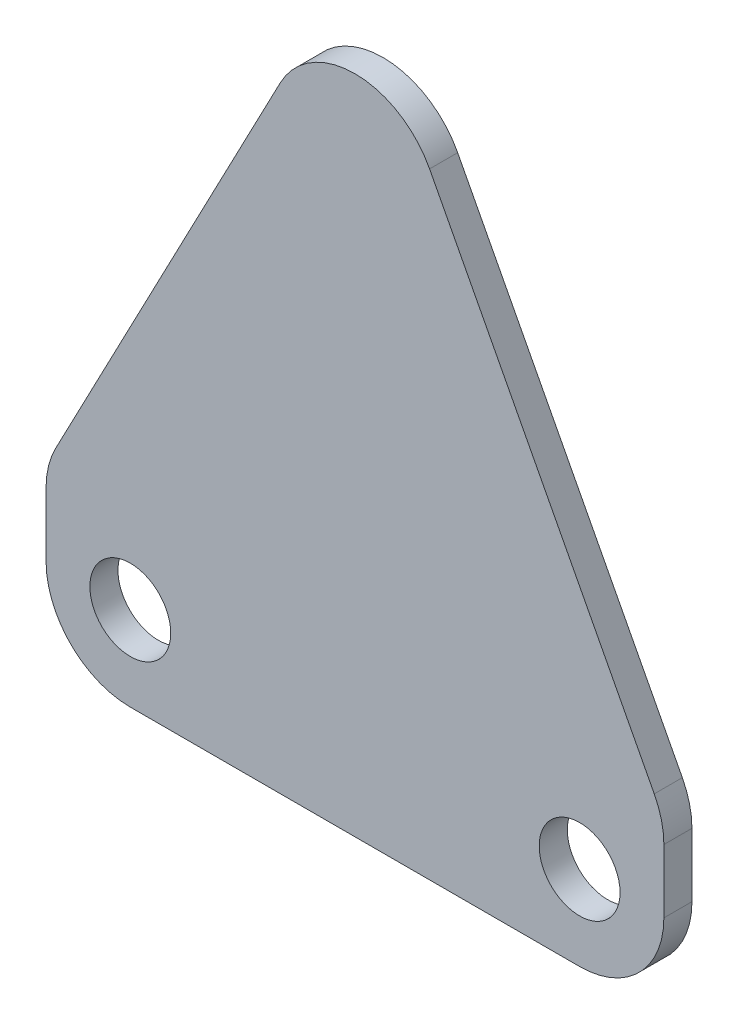
ISO-10303-21;
HEADER;
FILE_DESCRIPTION(('STEP AP214'),'2;1');
FILE_NAME('part.step','',(''),(''),'','','');
FILE_SCHEMA(('AUTOMOTIVE_DESIGN { 1 0 10303 214 1 1 1 1 }'));
ENDSEC;
DATA;
#1=APPLICATION_CONTEXT('core data for automotive mechanical design processes');
#2=APPLICATION_PROTOCOL_DEFINITION('international standard','automotive_design',2000,#1);
#3=PRODUCT_CONTEXT('',#1,'mechanical');
#4=PRODUCT('Part','Part','',(#3));
#5=PRODUCT_RELATED_PRODUCT_CATEGORY('part','',(#4));
#6=PRODUCT_DEFINITION_FORMATION('','',#4);
#7=PRODUCT_DEFINITION_CONTEXT('part definition',#1,'design');
#8=PRODUCT_DEFINITION('design','',#6,#7);
#9=PRODUCT_DEFINITION_SHAPE('','',#8);
#10=(LENGTH_UNIT() NAMED_UNIT(*) SI_UNIT(.MILLI.,.METRE.));
#11=(NAMED_UNIT(*) PLANE_ANGLE_UNIT() SI_UNIT($,.RADIAN.));
#12=(NAMED_UNIT(*) SI_UNIT($,.STERADIAN.) SOLID_ANGLE_UNIT());
#13=UNCERTAINTY_MEASURE_WITH_UNIT(LENGTH_MEASURE(1.E-05),#10,'distance_accuracy_value','');
#14=(GEOMETRIC_REPRESENTATION_CONTEXT(3) GLOBAL_UNCERTAINTY_ASSIGNED_CONTEXT((#13)) GLOBAL_UNIT_ASSIGNED_CONTEXT((#10,
#11,#12)) REPRESENTATION_CONTEXT('',''));
#15=CARTESIAN_POINT('',(0.,0.,0.));
#16=DIRECTION('',(0.,0.,1.));
#17=DIRECTION('',(1.,0.,0.));
#18=AXIS2_PLACEMENT_3D('',#15,#16,#17);
#19=CARTESIAN_POINT('',(0.,0.,1.5875));
#20=DIRECTION('',(0.,0.,-1.));
#21=DIRECTION('',(-1.,0.,0.));
#22=AXIS2_PLACEMENT_3D('',#19,#20,#21);
#23=PLANE('',#22);
#24=DIRECTION('',(0.,-1.,0.));
#25=VECTOR('',#24,1.);
#26=CARTESIAN_POINT('',(-17.4625,9.525,1.5875));
#27=LINE('',#26,#25);
#28=CARTESIAN_POINT('',(-17.4625,8.35319155858997,1.5875));
#29=VERTEX_POINT('',#28);
#30=CARTESIAN_POINT('',(-17.4625,4.7625,1.5875));
#31=VERTEX_POINT('',#30);
#32=EDGE_CURVE('E204',#29,#31,#27,.T.);
#33=ORIENTED_EDGE('',*,*,#32,.T.);
#34=CARTESIAN_POINT('',(-12.7,4.7625,1.5875));
#35=DIRECTION('',(0.,0.,-1.));
#36=DIRECTION('',(-1.,0.,0.));
#37=AXIS2_PLACEMENT_3D('',#34,#35,#36);
#38=CIRCLE('',#37,4.7625);
#39=CARTESIAN_POINT('',(-12.7,0.,1.5875));
#40=VERTEX_POINT('',#39);
#41=EDGE_CURVE('E175',#31,#40,#38,.F.);
#42=ORIENTED_EDGE('',*,*,#41,.T.);
#43=DIRECTION('',(1.,0.,0.));
#44=VECTOR('',#43,1.);
#45=CARTESIAN_POINT('',(-17.4625,0.,1.5875));
#46=LINE('',#45,#44);
#47=CARTESIAN_POINT('',(12.7,0.,1.5875));
#48=VERTEX_POINT('',#47);
#49=EDGE_CURVE('E141',#40,#48,#46,.T.);
#50=ORIENTED_EDGE('',*,*,#49,.T.);
#51=CARTESIAN_POINT('',(12.7,4.7625,1.5875));
#52=DIRECTION('',(0.,0.,-1.));
#53=DIRECTION('',(-1.,0.,0.));
#54=AXIS2_PLACEMENT_3D('',#51,#52,#53);
#55=CIRCLE('',#54,4.7625);
#56=CARTESIAN_POINT('',(17.4625,4.7625,1.5875));
#57=VERTEX_POINT('',#56);
#58=EDGE_CURVE('E171',#48,#57,#55,.F.);
#59=ORIENTED_EDGE('',*,*,#58,.T.);
#60=DIRECTION('',(0.,1.,0.));
#61=VECTOR('',#60,1.);
#62=CARTESIAN_POINT('',(17.4625,0.,1.5875));
#63=LINE('',#62,#61);
#64=CARTESIAN_POINT('',(17.4625,8.35319155858996,1.5875));
#65=VERTEX_POINT('',#64);
#66=EDGE_CURVE('E149',#57,#65,#63,.T.);
#67=ORIENTED_EDGE('',*,*,#66,.T.);
#68=CARTESIAN_POINT('',(12.7,8.35319155858997,1.5875));
#69=DIRECTION('',(0.,0.,-1.));
#70=DIRECTION('',(-1.,0.,0.));
#71=AXIS2_PLACEMENT_3D('',#68,#69,#70);
#72=CIRCLE('',#71,4.7625);
#73=CARTESIAN_POINT('',(16.9187726867717,10.5630248707085,1.5875));
#74=VERTEX_POINT('',#73);
#75=EDGE_CURVE('E168',#65,#74,#72,.F.);
#76=ORIENTED_EDGE('',*,*,#75,.T.);
#77=DIRECTION('',(-0.464006994670557,0.885831535280155,0.));
#78=VECTOR('',#77,1.);
#79=CARTESIAN_POINT('',(17.4625,9.525,1.5875));
#80=LINE('',#79,#78);
#81=CARTESIAN_POINT('',(4.21877268677174,34.808479416163,1.5875));
#82=VERTEX_POINT('',#81);
#83=EDGE_CURVE('E153',#74,#82,#80,.T.);
#84=ORIENTED_EDGE('',*,*,#83,.T.);
#85=CARTESIAN_POINT('',(0.,32.5986461040445,1.5875));
#86=DIRECTION('',(0.,0.,-1.));
#87=DIRECTION('',(-1.,0.,0.));
#88=AXIS2_PLACEMENT_3D('',#85,#86,#87);
#89=CIRCLE('',#88,4.7625);
#90=CARTESIAN_POINT('',(-4.21877268677174,34.808479416163,1.5875));
#91=VERTEX_POINT('',#90);
#92=EDGE_CURVE('E65',#82,#91,#89,.F.);
#93=ORIENTED_EDGE('',*,*,#92,.T.);
#94=DIRECTION('',(-0.464006994670557,-0.885831535280155,0.));
#95=VECTOR('',#94,1.);
#96=CARTESIAN_POINT('',(0.,42.8625,1.5875));
#97=LINE('',#96,#95);
#98=CARTESIAN_POINT('',(-16.9187726867717,10.5630248707085,1.5875));
#99=VERTEX_POINT('',#98);
#100=EDGE_CURVE('E207',#91,#99,#97,.T.);
#101=ORIENTED_EDGE('',*,*,#100,.T.);
#102=CARTESIAN_POINT('',(-12.7,8.35319155858997,1.5875));
#103=DIRECTION('',(0.,0.,-1.));
#104=DIRECTION('',(-1.,0.,0.));
#105=AXIS2_PLACEMENT_3D('',#102,#103,#104);
#106=CIRCLE('',#105,4.7625);
#107=EDGE_CURVE('E173',#99,#29,#106,.F.);
#108=ORIENTED_EDGE('',*,*,#107,.T.);
#109=EDGE_LOOP('',(#33,#42,#50,#59,#67,#76,#84,#93,#101,#108));
#110=FACE_BOUND('',#109,.T.);
#111=CARTESIAN_POINT('',(-12.7,4.7625,1.5875));
#112=DIRECTION('',(0.,0.,1.));
#113=DIRECTION('',(1.,0.,0.));
#114=AXIS2_PLACEMENT_3D('',#111,#112,#113);
#115=CIRCLE('',#114,2.286);
#116=CARTESIAN_POINT('',(-10.414,4.7625,1.5875));
#117=VERTEX_POINT('',#116);
#118=EDGE_CURVE('E200',#117,#117,#115,.T.);
#119=ORIENTED_EDGE('',*,*,#118,.F.);
#120=EDGE_LOOP('',(#119));
#121=FACE_BOUND('',#120,.T.);
#122=CARTESIAN_POINT('',(12.7,4.7625,1.5875));
#123=DIRECTION('',(0.,0.,1.));
#124=DIRECTION('',(1.,0.,0.));
#125=AXIS2_PLACEMENT_3D('',#122,#123,#124);
#126=CIRCLE('',#125,2.286);
#127=CARTESIAN_POINT('',(14.986,4.7625,1.5875));
#128=VERTEX_POINT('',#127);
#129=EDGE_CURVE('E213',#128,#128,#126,.T.);
#130=ORIENTED_EDGE('',*,*,#129,.F.);
#131=EDGE_LOOP('',(#130));
#132=FACE_BOUND('',#131,.T.);
#133=ADVANCED_FACE('F43',(#110,#121,#132),#23,.F.);
#134=CARTESIAN_POINT('',(0.,0.,0.));
#135=DIRECTION('',(0.,0.,-1.));
#136=DIRECTION('',(-1.,0.,0.));
#137=AXIS2_PLACEMENT_3D('',#134,#135,#136);
#138=PLANE('',#137);
#139=CARTESIAN_POINT('',(-12.7,4.7625,0.));
#140=DIRECTION('',(0.,0.,1.));
#141=DIRECTION('',(1.,0.,0.));
#142=AXIS2_PLACEMENT_3D('',#139,#140,#141);
#143=CIRCLE('',#142,2.286);
#144=CARTESIAN_POINT('',(-10.414,4.7625,0.));
#145=VERTEX_POINT('',#144);
#146=EDGE_CURVE('E210',#145,#145,#143,.T.);
#147=ORIENTED_EDGE('',*,*,#146,.T.);
#148=EDGE_LOOP('',(#147));
#149=FACE_BOUND('',#148,.T.);
#150=DIRECTION('',(1.,0.,0.));
#151=VECTOR('',#150,1.);
#152=CARTESIAN_POINT('',(-17.4625,0.,0.));
#153=LINE('',#152,#151);
#154=CARTESIAN_POINT('',(-12.7,0.,0.));
#155=VERTEX_POINT('',#154);
#156=CARTESIAN_POINT('',(12.7,0.,0.));
#157=VERTEX_POINT('',#156);
#158=EDGE_CURVE('E138',#155,#157,#153,.T.);
#159=ORIENTED_EDGE('',*,*,#158,.F.);
#160=CARTESIAN_POINT('',(-12.7,4.7625,0.));
#161=DIRECTION('',(0.,0.,-1.));
#162=DIRECTION('',(-1.,0.,0.));
#163=AXIS2_PLACEMENT_3D('',#160,#161,#162);
#164=CIRCLE('',#163,4.7625);
#165=CARTESIAN_POINT('',(-17.4625,4.7625,0.));
#166=VERTEX_POINT('',#165);
#167=EDGE_CURVE('E121',#155,#166,#164,.T.);
#168=ORIENTED_EDGE('',*,*,#167,.T.);
#169=DIRECTION('',(0.,-1.,0.));
#170=VECTOR('',#169,1.);
#171=CARTESIAN_POINT('',(-17.4625,9.525,0.));
#172=LINE('',#171,#170);
#173=CARTESIAN_POINT('',(-17.4625,8.35319155858997,0.));
#174=VERTEX_POINT('',#173);
#175=EDGE_CURVE('E150',#174,#166,#172,.T.);
#176=ORIENTED_EDGE('',*,*,#175,.F.);
#177=CARTESIAN_POINT('',(-12.7,8.35319155858997,0.));
#178=DIRECTION('',(0.,0.,-1.));
#179=DIRECTION('',(-1.,0.,0.));
#180=AXIS2_PLACEMENT_3D('',#177,#178,#179);
#181=CIRCLE('',#180,4.7625);
#182=CARTESIAN_POINT('',(-16.9187726867717,10.5630248707085,0.));
#183=VERTEX_POINT('',#182);
#184=EDGE_CURVE('E132',#174,#183,#181,.T.);
#185=ORIENTED_EDGE('',*,*,#184,.T.);
#186=DIRECTION('',(-0.464006994670557,-0.885831535280155,0.));
#187=VECTOR('',#186,1.);
#188=CARTESIAN_POINT('',(0.,42.8625,0.));
#189=LINE('',#188,#187);
#190=CARTESIAN_POINT('',(-4.21877268677174,34.808479416163,0.));
#191=VERTEX_POINT('',#190);
#192=EDGE_CURVE('E155',#191,#183,#189,.T.);
#193=ORIENTED_EDGE('',*,*,#192,.F.);
#194=CARTESIAN_POINT('',(0.,32.5986461040445,0.));
#195=DIRECTION('',(0.,0.,-1.));
#196=DIRECTION('',(-1.,0.,0.));
#197=AXIS2_PLACEMENT_3D('',#194,#195,#196);
#198=CIRCLE('',#197,4.7625);
#199=CARTESIAN_POINT('',(4.21877268677174,34.808479416163,0.));
#200=VERTEX_POINT('',#199);
#201=EDGE_CURVE('E161',#191,#200,#198,.T.);
#202=ORIENTED_EDGE('',*,*,#201,.T.);
#203=DIRECTION('',(-0.464006994670557,0.885831535280155,0.));
#204=VECTOR('',#203,1.);
#205=CARTESIAN_POINT('',(17.4625,9.525,0.));
#206=LINE('',#205,#204);
#207=CARTESIAN_POINT('',(16.9187726867717,10.5630248707085,0.));
#208=VERTEX_POINT('',#207);
#209=EDGE_CURVE('E192',#208,#200,#206,.T.);
#210=ORIENTED_EDGE('',*,*,#209,.F.);
#211=CARTESIAN_POINT('',(12.7,8.35319155858997,0.));
#212=DIRECTION('',(0.,0.,-1.));
#213=DIRECTION('',(-1.,0.,0.));
#214=AXIS2_PLACEMENT_3D('',#211,#212,#213);
#215=CIRCLE('',#214,4.7625);
#216=CARTESIAN_POINT('',(17.4625,8.35319155858996,0.));
#217=VERTEX_POINT('',#216);
#218=EDGE_CURVE('E142',#208,#217,#215,.T.);
#219=ORIENTED_EDGE('',*,*,#218,.T.);
#220=DIRECTION('',(0.,1.,0.));
#221=VECTOR('',#220,1.);
#222=CARTESIAN_POINT('',(17.4625,0.,0.));
#223=LINE('',#222,#221);
#224=CARTESIAN_POINT('',(17.4625,4.7625,0.));
#225=VERTEX_POINT('',#224);
#226=EDGE_CURVE('E198',#225,#217,#223,.T.);
#227=ORIENTED_EDGE('',*,*,#226,.F.);
#228=CARTESIAN_POINT('',(12.7,4.7625,0.));
#229=DIRECTION('',(0.,0.,-1.));
#230=DIRECTION('',(-1.,0.,0.));
#231=AXIS2_PLACEMENT_3D('',#228,#229,#230);
#232=CIRCLE('',#231,4.7625);
#233=EDGE_CURVE('E148',#225,#157,#232,.T.);
#234=ORIENTED_EDGE('',*,*,#233,.T.);
#235=EDGE_LOOP('',(#159,#168,#176,#185,#193,#202,#210,#219,#227,#234));
#236=FACE_BOUND('',#235,.T.);
#237=CARTESIAN_POINT('',(12.7,4.7625,0.));
#238=DIRECTION('',(0.,0.,1.));
#239=DIRECTION('',(1.,0.,0.));
#240=AXIS2_PLACEMENT_3D('',#237,#238,#239);
#241=CIRCLE('',#240,2.286);
#242=CARTESIAN_POINT('',(14.986,4.7625,0.));
#243=VERTEX_POINT('',#242);
#244=EDGE_CURVE('E216',#243,#243,#241,.T.);
#245=ORIENTED_EDGE('',*,*,#244,.T.);
#246=EDGE_LOOP('',(#245));
#247=FACE_BOUND('',#246,.T.);
#248=ADVANCED_FACE('F145',(#149,#236,#247),#138,.T.);
#249=CARTESIAN_POINT('',(17.4625,0.,1.5875));
#250=DIRECTION('',(-1.,0.,0.));
#251=DIRECTION('',(0.,0.,1.));
#252=AXIS2_PLACEMENT_3D('',#249,#250,#251);
#253=PLANE('',#252);
#254=ORIENTED_EDGE('',*,*,#66,.F.);
#255=DIRECTION('',(0.,0.,-1.));
#256=VECTOR('',#255,1.);
#257=CARTESIAN_POINT('',(17.4625,4.7625,1.5875));
#258=LINE('',#257,#256);
#259=EDGE_CURVE('E183',#57,#225,#258,.T.);
#260=ORIENTED_EDGE('',*,*,#259,.T.);
#261=ORIENTED_EDGE('',*,*,#226,.T.);
#262=DIRECTION('',(0.,0.,-1.));
#263=VECTOR('',#262,1.);
#264=CARTESIAN_POINT('',(17.4625,8.35319155858997,1.5875));
#265=LINE('',#264,#263);
#266=EDGE_CURVE('E181',#217,#65,#265,.F.);
#267=ORIENTED_EDGE('',*,*,#266,.T.);
#268=EDGE_LOOP('',(#254,#260,#261,#267));
#269=FACE_BOUND('',#268,.T.);
#270=ADVANCED_FACE('F230',(#269),#253,.F.);
#271=CARTESIAN_POINT('',(17.4625,9.525,1.5875));
#272=DIRECTION('',(-0.885831535280155,-0.464006994670557,0.));
#273=DIRECTION('',(0.464006994670558,-0.885831535280156,0.));
#274=AXIS2_PLACEMENT_3D('',#271,#272,#273);
#275=PLANE('',#274);
#276=ORIENTED_EDGE('',*,*,#209,.T.);
#277=DIRECTION('',(0.,0.,-1.));
#278=VECTOR('',#277,1.);
#279=CARTESIAN_POINT('',(4.21877268677174,34.808479416163,1.5875));
#280=LINE('',#279,#278);
#281=EDGE_CURVE('E11',#200,#82,#280,.F.);
#282=ORIENTED_EDGE('',*,*,#281,.T.);
#283=ORIENTED_EDGE('',*,*,#83,.F.);
#284=DIRECTION('',(0.,0.,-1.));
#285=VECTOR('',#284,1.);
#286=CARTESIAN_POINT('',(16.9187726867717,10.5630248707085,1.5875));
#287=LINE('',#286,#285);
#288=EDGE_CURVE('E51',#74,#208,#287,.T.);
#289=ORIENTED_EDGE('',*,*,#288,.T.);
#290=EDGE_LOOP('',(#276,#282,#283,#289));
#291=FACE_BOUND('',#290,.T.);
#292=ADVANCED_FACE('F191',(#291),#275,.F.);
#293=CARTESIAN_POINT('',(0.,42.8625,1.5875));
#294=DIRECTION('',(0.885831535280155,-0.464006994670557,0.));
#295=DIRECTION('',(0.464006994670558,0.885831535280156,0.));
#296=AXIS2_PLACEMENT_3D('',#293,#294,#295);
#297=PLANE('',#296);
#298=ORIENTED_EDGE('',*,*,#192,.T.);
#299=DIRECTION('',(0.,0.,-1.));
#300=VECTOR('',#299,1.);
#301=CARTESIAN_POINT('',(-16.9187726867717,10.5630248707085,1.5875));
#302=LINE('',#301,#300);
#303=EDGE_CURVE('E58',#183,#99,#302,.F.);
#304=ORIENTED_EDGE('',*,*,#303,.T.);
#305=ORIENTED_EDGE('',*,*,#100,.F.);
#306=DIRECTION('',(0.,0.,-1.));
#307=VECTOR('',#306,1.);
#308=CARTESIAN_POINT('',(-4.21877268677174,34.808479416163,1.5875));
#309=LINE('',#308,#307);
#310=EDGE_CURVE('E177',#91,#191,#309,.T.);
#311=ORIENTED_EDGE('',*,*,#310,.T.);
#312=EDGE_LOOP('',(#298,#304,#305,#311));
#313=FACE_BOUND('',#312,.T.);
#314=ADVANCED_FACE('F243',(#313),#297,.F.);
#315=CARTESIAN_POINT('',(-17.4625,9.525,1.5875));
#316=DIRECTION('',(1.,0.,0.));
#317=DIRECTION('',(0.,0.,-1.));
#318=AXIS2_PLACEMENT_3D('',#315,#316,#317);
#319=PLANE('',#318);
#320=ORIENTED_EDGE('',*,*,#175,.T.);
#321=DIRECTION('',(0.,0.,-1.));
#322=VECTOR('',#321,1.);
#323=CARTESIAN_POINT('',(-17.4625,4.7625,1.5875));
#324=LINE('',#323,#322);
#325=EDGE_CURVE('E126',#166,#31,#324,.F.);
#326=ORIENTED_EDGE('',*,*,#325,.T.);
#327=ORIENTED_EDGE('',*,*,#32,.F.);
#328=DIRECTION('',(0.,0.,-1.));
#329=VECTOR('',#328,1.);
#330=CARTESIAN_POINT('',(-17.4625,8.35319155858997,1.5875));
#331=LINE('',#330,#329);
#332=EDGE_CURVE('E131',#29,#174,#331,.T.);
#333=ORIENTED_EDGE('',*,*,#332,.T.);
#334=EDGE_LOOP('',(#320,#326,#327,#333));
#335=FACE_BOUND('',#334,.T.);
#336=ADVANCED_FACE('F240',(#335),#319,.F.);
#337=CARTESIAN_POINT('',(-17.4625,0.,1.5875));
#338=DIRECTION('',(0.,1.,0.));
#339=DIRECTION('',(0.,0.,1.));
#340=AXIS2_PLACEMENT_3D('',#337,#338,#339);
#341=PLANE('',#340);
#342=ORIENTED_EDGE('',*,*,#49,.F.);
#343=DIRECTION('',(0.,0.,-1.));
#344=VECTOR('',#343,1.);
#345=CARTESIAN_POINT('',(-12.7,0.,1.5875));
#346=LINE('',#345,#344);
#347=EDGE_CURVE('E125',#40,#155,#346,.T.);
#348=ORIENTED_EDGE('',*,*,#347,.T.);
#349=ORIENTED_EDGE('',*,*,#158,.T.);
#350=DIRECTION('',(0.,0.,-1.));
#351=VECTOR('',#350,1.);
#352=CARTESIAN_POINT('',(12.7,0.,1.5875));
#353=LINE('',#352,#351);
#354=EDGE_CURVE('E143',#157,#48,#353,.F.);
#355=ORIENTED_EDGE('',*,*,#354,.T.);
#356=EDGE_LOOP('',(#342,#348,#349,#355));
#357=FACE_BOUND('',#356,.T.);
#358=ADVANCED_FACE('F137',(#357),#341,.F.);
#359=CARTESIAN_POINT('',(-12.7,4.7625,1.5875));
#360=DIRECTION('',(0.,0.,-1.));
#361=DIRECTION('',(-1.,0.,0.));
#362=AXIS2_PLACEMENT_3D('',#359,#360,#361);
#363=CYLINDRICAL_SURFACE('',#362,2.286);
#364=ORIENTED_EDGE('',*,*,#118,.T.);
#365=EDGE_LOOP('',(#364));
#366=FACE_BOUND('',#365,.T.);
#367=ORIENTED_EDGE('',*,*,#146,.F.);
#368=EDGE_LOOP('',(#367));
#369=FACE_BOUND('',#368,.T.);
#370=ADVANCED_FACE('F235',(#366,#369),#363,.F.);
#371=CARTESIAN_POINT('',(12.7,4.7625,1.5875));
#372=DIRECTION('',(0.,0.,-1.));
#373=DIRECTION('',(-1.,0.,0.));
#374=AXIS2_PLACEMENT_3D('',#371,#372,#373);
#375=CYLINDRICAL_SURFACE('',#374,2.286);
#376=ORIENTED_EDGE('',*,*,#129,.T.);
#377=EDGE_LOOP('',(#376));
#378=FACE_BOUND('',#377,.T.);
#379=ORIENTED_EDGE('',*,*,#244,.F.);
#380=EDGE_LOOP('',(#379));
#381=FACE_BOUND('',#380,.T.);
#382=ADVANCED_FACE('F222',(#378,#381),#375,.F.);
#383=CARTESIAN_POINT('',(-12.7,4.7625,1.5875));
#384=DIRECTION('',(0.,0.,-1.));
#385=DIRECTION('',(-1.,0.,0.));
#386=AXIS2_PLACEMENT_3D('',#383,#384,#385);
#387=CYLINDRICAL_SURFACE('',#386,4.7625);
#388=ORIENTED_EDGE('',*,*,#41,.F.);
#389=ORIENTED_EDGE('',*,*,#325,.F.);
#390=ORIENTED_EDGE('',*,*,#167,.F.);
#391=ORIENTED_EDGE('',*,*,#347,.F.);
#392=EDGE_LOOP('',(#388,#389,#390,#391));
#393=FACE_BOUND('',#392,.T.);
#394=ADVANCED_FACE('F124',(#393),#387,.T.);
#395=CARTESIAN_POINT('',(-12.7,8.35319155858997,1.5875));
#396=DIRECTION('',(0.,0.,-1.));
#397=DIRECTION('',(-1.,0.,0.));
#398=AXIS2_PLACEMENT_3D('',#395,#396,#397);
#399=CYLINDRICAL_SURFACE('',#398,4.7625);
#400=ORIENTED_EDGE('',*,*,#107,.F.);
#401=ORIENTED_EDGE('',*,*,#303,.F.);
#402=ORIENTED_EDGE('',*,*,#184,.F.);
#403=ORIENTED_EDGE('',*,*,#332,.F.);
#404=EDGE_LOOP('',(#400,#401,#402,#403));
#405=FACE_BOUND('',#404,.T.);
#406=ADVANCED_FACE('F254',(#405),#399,.T.);
#407=CARTESIAN_POINT('',(12.7,4.7625,1.5875));
#408=DIRECTION('',(0.,0.,-1.));
#409=DIRECTION('',(-1.,0.,0.));
#410=AXIS2_PLACEMENT_3D('',#407,#408,#409);
#411=CYLINDRICAL_SURFACE('',#410,4.7625);
#412=ORIENTED_EDGE('',*,*,#58,.F.);
#413=ORIENTED_EDGE('',*,*,#354,.F.);
#414=ORIENTED_EDGE('',*,*,#233,.F.);
#415=ORIENTED_EDGE('',*,*,#259,.F.);
#416=EDGE_LOOP('',(#412,#413,#414,#415));
#417=FACE_BOUND('',#416,.T.);
#418=ADVANCED_FACE('F257',(#417),#411,.T.);
#419=CARTESIAN_POINT('',(0.,32.5986461040445,1.5875));
#420=DIRECTION('',(0.,0.,-1.));
#421=DIRECTION('',(-1.,0.,0.));
#422=AXIS2_PLACEMENT_3D('',#419,#420,#421);
#423=CYLINDRICAL_SURFACE('',#422,4.7625);
#424=ORIENTED_EDGE('',*,*,#92,.F.);
#425=ORIENTED_EDGE('',*,*,#281,.F.);
#426=ORIENTED_EDGE('',*,*,#201,.F.);
#427=ORIENTED_EDGE('',*,*,#310,.F.);
#428=EDGE_LOOP('',(#424,#425,#426,#427));
#429=FACE_BOUND('',#428,.T.);
#430=ADVANCED_FACE('F260',(#429),#423,.T.);
#431=CARTESIAN_POINT('',(12.7,8.35319155858997,1.5875));
#432=DIRECTION('',(0.,0.,-1.));
#433=DIRECTION('',(-1.,0.,0.));
#434=AXIS2_PLACEMENT_3D('',#431,#432,#433);
#435=CYLINDRICAL_SURFACE('',#434,4.7625);
#436=ORIENTED_EDGE('',*,*,#75,.F.);
#437=ORIENTED_EDGE('',*,*,#266,.F.);
#438=ORIENTED_EDGE('',*,*,#218,.F.);
#439=ORIENTED_EDGE('',*,*,#288,.F.);
#440=EDGE_LOOP('',(#436,#437,#438,#439));
#441=FACE_BOUND('',#440,.T.);
#442=ADVANCED_FACE('F45',(#441),#435,.T.);
#443=CLOSED_SHELL('',(#133,#248,#270,#292,#314,#336,#358,#370,#382,#394,#406,#418,#430,#442));
#444=MANIFOLD_SOLID_BREP('B2',#443);
#445=ADVANCED_BREP_SHAPE_REPRESENTATION('',(#18,#444),#14);
#446=SHAPE_DEFINITION_REPRESENTATION(#9,#445);
ENDSEC;
END-ISO-10303-21;
